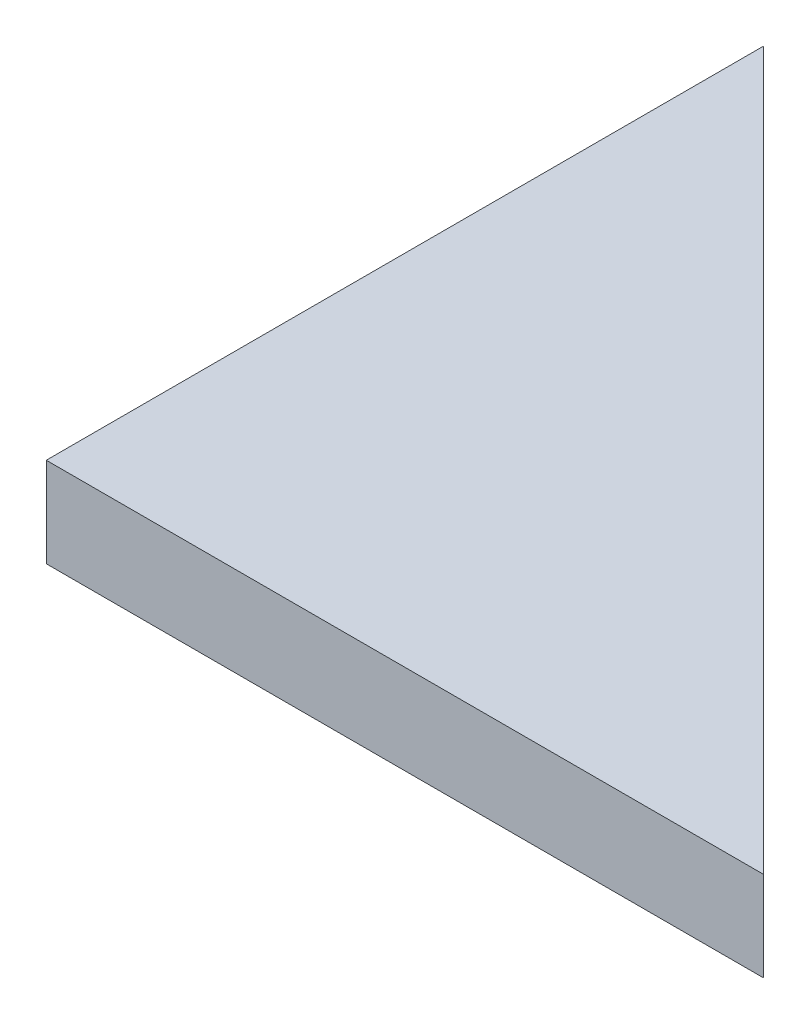
ISO-10303-21;
HEADER;
FILE_DESCRIPTION(('STEP AP214'),'2;1');
FILE_NAME('part.step','',(''),(''),'','','');
FILE_SCHEMA(('AUTOMOTIVE_DESIGN { 1 0 10303 214 1 1 1 1 }'));
ENDSEC;
DATA;
#1=APPLICATION_CONTEXT('core data for automotive mechanical design processes');
#2=APPLICATION_PROTOCOL_DEFINITION('international standard','automotive_design',2000,#1);
#3=PRODUCT_CONTEXT('',#1,'mechanical');
#4=PRODUCT('Part','Part','',(#3));
#5=PRODUCT_RELATED_PRODUCT_CATEGORY('part','',(#4));
#6=PRODUCT_DEFINITION_FORMATION('','',#4);
#7=PRODUCT_DEFINITION_CONTEXT('part definition',#1,'design');
#8=PRODUCT_DEFINITION('design','',#6,#7);
#9=PRODUCT_DEFINITION_SHAPE('','',#8);
#10=(LENGTH_UNIT() NAMED_UNIT(*) SI_UNIT(.MILLI.,.METRE.));
#11=(NAMED_UNIT(*) PLANE_ANGLE_UNIT() SI_UNIT($,.RADIAN.));
#12=(NAMED_UNIT(*) SI_UNIT($,.STERADIAN.) SOLID_ANGLE_UNIT());
#13=UNCERTAINTY_MEASURE_WITH_UNIT(LENGTH_MEASURE(1.E-05),#10,'distance_accuracy_value','');
#14=(GEOMETRIC_REPRESENTATION_CONTEXT(3) GLOBAL_UNCERTAINTY_ASSIGNED_CONTEXT((#13)) GLOBAL_UNIT_ASSIGNED_CONTEXT((#10,
#11,#12)) REPRESENTATION_CONTEXT('',''));
#15=CARTESIAN_POINT('',(0.,0.,0.));
#16=DIRECTION('',(0.,0.,1.));
#17=DIRECTION('',(1.,0.,0.));
#18=AXIS2_PLACEMENT_3D('',#15,#16,#17);
#19=CARTESIAN_POINT('',(0.,3.175,-25.3999999999997));
#20=DIRECTION('',(1.,0.,0.));
#21=DIRECTION('',(0.,0.,-1.));
#22=AXIS2_PLACEMENT_3D('',#19,#20,#21);
#23=PLANE('',#22);
#24=DIRECTION('',(0.,0.,1.));
#25=VECTOR('',#24,1.);
#26=CARTESIAN_POINT('',(0.,0.,-25.3999999999997));
#27=LINE('',#26,#25);
#28=CARTESIAN_POINT('',(0.,0.,-25.3999999999997));
#29=VERTEX_POINT('',#28);
#30=CARTESIAN_POINT('',(0.,0.,0.));
#31=VERTEX_POINT('',#30);
#32=EDGE_CURVE('E82',#29,#31,#27,.T.);
#33=ORIENTED_EDGE('',*,*,#32,.T.);
#34=DIRECTION('',(0.,-1.,0.));
#35=VECTOR('',#34,1.);
#36=CARTESIAN_POINT('',(0.,3.175,0.));
#37=LINE('',#36,#35);
#38=CARTESIAN_POINT('',(0.,3.175,0.));
#39=VERTEX_POINT('',#38);
#40=EDGE_CURVE('E11',#39,#31,#37,.T.);
#41=ORIENTED_EDGE('',*,*,#40,.F.);
#42=DIRECTION('',(0.,0.,1.));
#43=VECTOR('',#42,1.);
#44=CARTESIAN_POINT('',(0.,3.175,-25.3999999999997));
#45=LINE('',#44,#43);
#46=CARTESIAN_POINT('',(0.,3.175,-25.3999999999997));
#47=VERTEX_POINT('',#46);
#48=EDGE_CURVE('E75',#47,#39,#45,.T.);
#49=ORIENTED_EDGE('',*,*,#48,.F.);
#50=DIRECTION('',(0.,-1.,0.));
#51=VECTOR('',#50,1.);
#52=CARTESIAN_POINT('',(0.,3.175,-25.3999999999997));
#53=LINE('',#52,#51);
#54=EDGE_CURVE('E83',#47,#29,#53,.T.);
#55=ORIENTED_EDGE('',*,*,#54,.T.);
#56=EDGE_LOOP('',(#33,#41,#49,#55));
#57=FACE_BOUND('',#56,.T.);
#58=ADVANCED_FACE('F35',(#57),#23,.F.);
#59=CARTESIAN_POINT('',(0.,3.175,0.));
#60=DIRECTION('',(0.,0.,-1.));
#61=DIRECTION('',(-1.,0.,0.));
#62=AXIS2_PLACEMENT_3D('',#59,#60,#61);
#63=PLANE('',#62);
#64=DIRECTION('',(1.,0.,0.));
#65=VECTOR('',#64,1.);
#66=CARTESIAN_POINT('',(0.,0.,0.));
#67=LINE('',#66,#65);
#68=CARTESIAN_POINT('',(25.4,0.,0.));
#69=VERTEX_POINT('',#68);
#70=EDGE_CURVE('E63',#31,#69,#67,.T.);
#71=ORIENTED_EDGE('',*,*,#70,.T.);
#72=DIRECTION('',(0.,-1.,0.));
#73=VECTOR('',#72,1.);
#74=CARTESIAN_POINT('',(25.4,3.175,0.));
#75=LINE('',#74,#73);
#76=CARTESIAN_POINT('',(25.4,3.175,0.));
#77=VERTEX_POINT('',#76);
#78=EDGE_CURVE('E43',#77,#69,#75,.T.);
#79=ORIENTED_EDGE('',*,*,#78,.F.);
#80=DIRECTION('',(1.,0.,0.));
#81=VECTOR('',#80,1.);
#82=CARTESIAN_POINT('',(0.,3.175,0.));
#83=LINE('',#82,#81);
#84=EDGE_CURVE('E71',#39,#77,#83,.T.);
#85=ORIENTED_EDGE('',*,*,#84,.F.);
#86=ORIENTED_EDGE('',*,*,#40,.T.);
#87=EDGE_LOOP('',(#71,#79,#85,#86));
#88=FACE_BOUND('',#87,.T.);
#89=ADVANCED_FACE('F72',(#88),#63,.F.);
#90=CARTESIAN_POINT('',(25.4,3.175,0.));
#91=DIRECTION('',(-0.707106781186544,0.,0.707106781186551));
#92=DIRECTION('',(0.707106781186551,0.,0.707106781186544));
#93=AXIS2_PLACEMENT_3D('',#90,#91,#92);
#94=PLANE('',#93);
#95=DIRECTION('',(-0.707106781186551,0.,-0.707106781186544));
#96=VECTOR('',#95,1.);
#97=CARTESIAN_POINT('',(25.4,0.,0.));
#98=LINE('',#97,#96);
#99=EDGE_CURVE('E68',#69,#29,#98,.T.);
#100=ORIENTED_EDGE('',*,*,#99,.T.);
#101=ORIENTED_EDGE('',*,*,#54,.F.);
#102=DIRECTION('',(-0.707106781186551,0.,-0.707106781186544));
#103=VECTOR('',#102,1.);
#104=CARTESIAN_POINT('',(25.4,3.175,0.));
#105=LINE('',#104,#103);
#106=EDGE_CURVE('E51',#77,#47,#105,.T.);
#107=ORIENTED_EDGE('',*,*,#106,.F.);
#108=ORIENTED_EDGE('',*,*,#78,.T.);
#109=EDGE_LOOP('',(#100,#101,#107,#108));
#110=FACE_BOUND('',#109,.T.);
#111=ADVANCED_FACE('F90',(#110),#94,.F.);
#112=CARTESIAN_POINT('',(0.,3.175,0.));
#113=DIRECTION('',(0.,1.,0.));
#114=DIRECTION('',(0.,0.,1.));
#115=AXIS2_PLACEMENT_3D('',#112,#113,#114);
#116=PLANE('',#115);
#117=ORIENTED_EDGE('',*,*,#48,.T.);
#118=ORIENTED_EDGE('',*,*,#84,.T.);
#119=ORIENTED_EDGE('',*,*,#106,.T.);
#120=EDGE_LOOP('',(#117,#118,#119));
#121=FACE_BOUND('',#120,.T.);
#122=ADVANCED_FACE('F78',(#121),#116,.T.);
#123=CARTESIAN_POINT('',(0.,0.,0.));
#124=DIRECTION('',(0.,1.,0.));
#125=DIRECTION('',(0.,0.,1.));
#126=AXIS2_PLACEMENT_3D('',#123,#124,#125);
#127=PLANE('',#126);
#128=ORIENTED_EDGE('',*,*,#32,.F.);
#129=ORIENTED_EDGE('',*,*,#99,.F.);
#130=ORIENTED_EDGE('',*,*,#70,.F.);
#131=EDGE_LOOP('',(#128,#129,#130));
#132=FACE_BOUND('',#131,.T.);
#133=ADVANCED_FACE('F91',(#132),#127,.F.);
#134=CLOSED_SHELL('',(#58,#89,#111,#122,#133));
#135=MANIFOLD_SOLID_BREP('B2',#134);
#136=ADVANCED_BREP_SHAPE_REPRESENTATION('',(#18,#135),#14);
#137=SHAPE_DEFINITION_REPRESENTATION(#9,#136);
ENDSEC;
END-ISO-10303-21;
